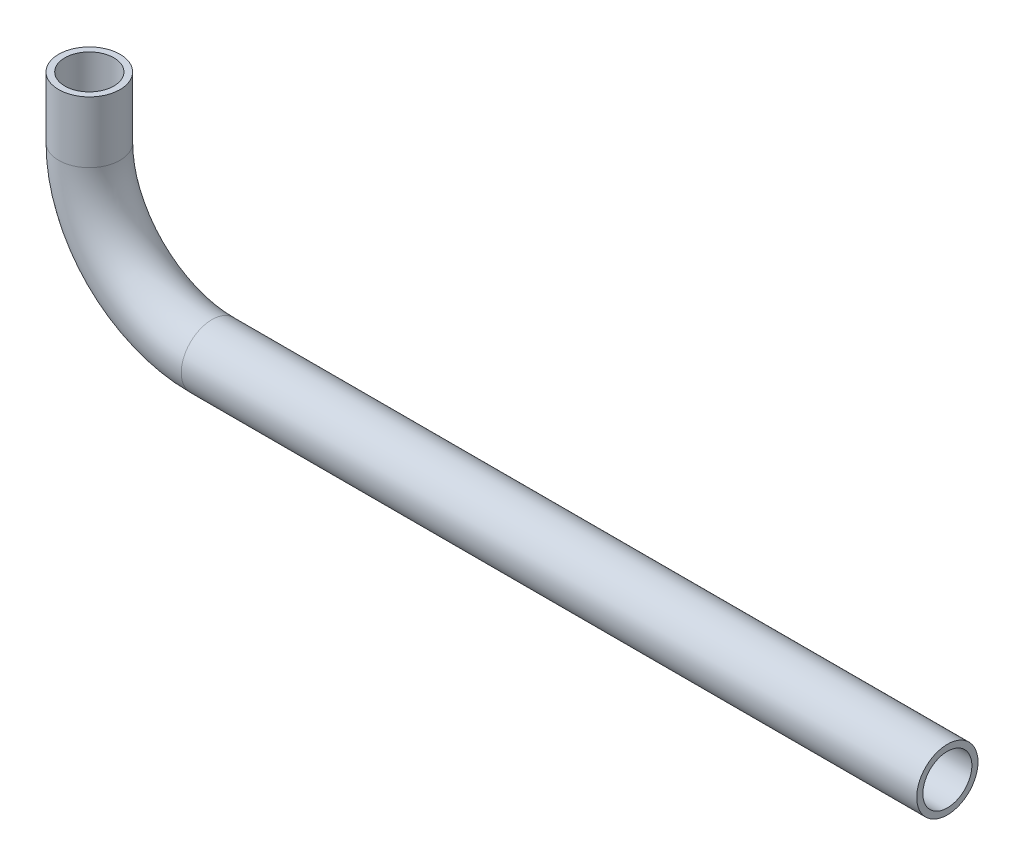
ISO-10303-21;
HEADER;
FILE_DESCRIPTION(('STEP AP214'),'2;1');
FILE_NAME('part.step','',(''),(''),'','','');
FILE_SCHEMA(('AUTOMOTIVE_DESIGN { 1 0 10303 214 1 1 1 1 }'));
ENDSEC;
DATA;
#1=APPLICATION_CONTEXT('core data for automotive mechanical design processes');
#2=APPLICATION_PROTOCOL_DEFINITION('international standard','automotive_design',2000,#1);
#3=PRODUCT_CONTEXT('',#1,'mechanical');
#4=PRODUCT('Part','Part','',(#3));
#5=PRODUCT_RELATED_PRODUCT_CATEGORY('part','',(#4));
#6=PRODUCT_DEFINITION_FORMATION('','',#4);
#7=PRODUCT_DEFINITION_CONTEXT('part definition',#1,'design');
#8=PRODUCT_DEFINITION('design','',#6,#7);
#9=PRODUCT_DEFINITION_SHAPE('','',#8);
#10=(LENGTH_UNIT() NAMED_UNIT(*) SI_UNIT(.MILLI.,.METRE.));
#11=(NAMED_UNIT(*) PLANE_ANGLE_UNIT() SI_UNIT($,.RADIAN.));
#12=(NAMED_UNIT(*) SI_UNIT($,.STERADIAN.) SOLID_ANGLE_UNIT());
#13=UNCERTAINTY_MEASURE_WITH_UNIT(LENGTH_MEASURE(1.E-05),#10,'distance_accuracy_value','');
#14=(GEOMETRIC_REPRESENTATION_CONTEXT(3) GLOBAL_UNCERTAINTY_ASSIGNED_CONTEXT((#13)) GLOBAL_UNIT_ASSIGNED_CONTEXT((#10,
#11,#12)) REPRESENTATION_CONTEXT('',''));
#15=CARTESIAN_POINT('',(0.,0.,0.));
#16=DIRECTION('',(0.,0.,1.));
#17=DIRECTION('',(1.,0.,0.));
#18=AXIS2_PLACEMENT_3D('',#15,#16,#17);
#19=CARTESIAN_POINT('',(-20.,30.,0.));
#20=DIRECTION('',(0.,-1.,0.));
#21=DIRECTION('',(0.,0.,-1.));
#22=AXIS2_PLACEMENT_3D('',#19,#20,#21);
#23=PLANE('',#22);
#24=CARTESIAN_POINT('',(-20.,30.,0.));
#25=DIRECTION('',(0.,-1.,0.));
#26=DIRECTION('',(0.,0.,-1.));
#27=AXIS2_PLACEMENT_3D('',#24,#25,#26);
#28=CIRCLE('',#27,4.);
#29=CARTESIAN_POINT('',(-20.,30.,-4.));
#30=VERTEX_POINT('',#29);
#31=EDGE_CURVE('E72',#30,#30,#28,.T.);
#32=ORIENTED_EDGE('',*,*,#31,.T.);
#33=EDGE_LOOP('',(#32));
#34=FACE_BOUND('',#33,.T.);
#35=CARTESIAN_POINT('',(-20.,30.,0.));
#36=DIRECTION('',(0.,-1.,0.));
#37=DIRECTION('',(0.,0.,-1.));
#38=AXIS2_PLACEMENT_3D('',#35,#36,#37);
#39=CIRCLE('',#38,5.);
#40=CARTESIAN_POINT('',(-20.,30.,-5.));
#41=VERTEX_POINT('',#40);
#42=EDGE_CURVE('E63',#41,#41,#39,.T.);
#43=ORIENTED_EDGE('',*,*,#42,.F.);
#44=EDGE_LOOP('',(#43));
#45=FACE_BOUND('',#44,.T.);
#46=ADVANCED_FACE('F49',(#34,#45),#23,.F.);
#47=CARTESIAN_POINT('',(120.,0.,0.));
#48=DIRECTION('',(1.,0.,0.));
#49=DIRECTION('',(0.,0.,-1.));
#50=AXIS2_PLACEMENT_3D('',#47,#48,#49);
#51=PLANE('',#50);
#52=CARTESIAN_POINT('',(120.,0.,0.));
#53=DIRECTION('',(1.,0.,0.));
#54=DIRECTION('',(0.,0.,-1.));
#55=AXIS2_PLACEMENT_3D('',#52,#53,#54);
#56=CIRCLE('',#55,4.);
#57=CARTESIAN_POINT('',(120.,0.,-4.));
#58=VERTEX_POINT('',#57);
#59=EDGE_CURVE('E68',#58,#58,#56,.T.);
#60=ORIENTED_EDGE('',*,*,#59,.F.);
#61=EDGE_LOOP('',(#60));
#62=FACE_BOUND('',#61,.T.);
#63=CARTESIAN_POINT('',(120.,0.,0.));
#64=DIRECTION('',(1.,0.,0.));
#65=DIRECTION('',(0.,0.,-1.));
#66=AXIS2_PLACEMENT_3D('',#63,#64,#65);
#67=CIRCLE('',#66,5.);
#68=CARTESIAN_POINT('',(120.,0.,-5.));
#69=VERTEX_POINT('',#68);
#70=EDGE_CURVE('E11',#69,#69,#67,.T.);
#71=ORIENTED_EDGE('',*,*,#70,.T.);
#72=EDGE_LOOP('',(#71));
#73=FACE_BOUND('',#72,.T.);
#74=ADVANCED_FACE('F108',(#62,#73),#51,.T.);
#75=CARTESIAN_POINT('',(-20.,30.,0.));
#76=DIRECTION('',(0.,-1.,0.));
#77=DIRECTION('',(0.,0.,-1.));
#78=AXIS2_PLACEMENT_3D('',#75,#76,#77);
#79=CYLINDRICAL_SURFACE('',#78,5.);
#80=CARTESIAN_POINT('',(-20.,20.,0.));
#81=DIRECTION('',(0.,-1.,0.));
#82=DIRECTION('',(0.,0.,-1.));
#83=AXIS2_PLACEMENT_3D('',#80,#81,#82);
#84=CIRCLE('',#83,5.);
#85=CARTESIAN_POINT('',(-25.,20.,0.));
#86=VERTEX_POINT('',#85);
#87=EDGE_CURVE('E59',#86,#86,#84,.T.);
#88=ORIENTED_EDGE('',*,*,#87,.F.);
#89=EDGE_LOOP('',(#88));
#90=FACE_BOUND('',#89,.T.);
#91=ORIENTED_EDGE('',*,*,#42,.T.);
#92=EDGE_LOOP('',(#91));
#93=FACE_BOUND('',#92,.T.);
#94=ADVANCED_FACE('F104',(#90,#93),#79,.T.);
#95=CARTESIAN_POINT('',(0.,20.,0.));
#96=DIRECTION('',(0.,0.,1.));
#97=DIRECTION('',(1.,0.,0.));
#98=AXIS2_PLACEMENT_3D('',#95,#96,#97);
#99=TOROIDAL_SURFACE('',#98,20.,5.);
#100=CARTESIAN_POINT('',(0.,0.,0.));
#101=DIRECTION('',(1.,0.,0.));
#102=DIRECTION('',(0.,0.,-1.));
#103=AXIS2_PLACEMENT_3D('',#100,#101,#102);
#104=CIRCLE('',#103,5.);
#105=CARTESIAN_POINT('',(0.,-5.,0.));
#106=VERTEX_POINT('',#105);
#107=EDGE_CURVE('E55',#106,#106,#104,.T.);
#108=CARTESIAN_POINT('',(0.,20.,0.));
#109=DIRECTION('',(0.,0.,1.));
#110=DIRECTION('',(1.,0.,0.));
#111=AXIS2_PLACEMENT_3D('',#108,#109,#110);
#112=CIRCLE('',#111,25.);
#113=EDGE_CURVE('',#86,#106,#112,.T.);
#114=ORIENTED_EDGE('',*,*,#87,.T.);
#115=ORIENTED_EDGE('',*,*,#107,.F.);
#116=ORIENTED_EDGE('',*,*,#113,.T.);
#117=ORIENTED_EDGE('',*,*,#113,.F.);
#118=EDGE_LOOP('',(#114,#116,#115,#117));
#119=FACE_BOUND('',#118,.T.);
#120=ADVANCED_FACE('F98',(#119),#99,.T.);
#121=CARTESIAN_POINT('',(0.,0.,0.));
#122=DIRECTION('',(1.,0.,0.));
#123=DIRECTION('',(0.,0.,-1.));
#124=AXIS2_PLACEMENT_3D('',#121,#122,#123);
#125=CYLINDRICAL_SURFACE('',#124,5.);
#126=ORIENTED_EDGE('',*,*,#70,.F.);
#127=EDGE_LOOP('',(#126));
#128=FACE_BOUND('',#127,.T.);
#129=ORIENTED_EDGE('',*,*,#107,.T.);
#130=EDGE_LOOP('',(#129));
#131=FACE_BOUND('',#130,.T.);
#132=ADVANCED_FACE('F95',(#128,#131),#125,.T.);
#133=CARTESIAN_POINT('',(-20.,30.,0.));
#134=DIRECTION('',(0.,-1.,0.));
#135=DIRECTION('',(0.,0.,-1.));
#136=AXIS2_PLACEMENT_3D('',#133,#134,#135);
#137=CYLINDRICAL_SURFACE('',#136,4.);
#138=CARTESIAN_POINT('',(-20.,20.,0.));
#139=DIRECTION('',(0.,1.,0.));
#140=DIRECTION('',(-1.,0.,0.));
#141=AXIS2_PLACEMENT_3D('',#138,#139,#140);
#142=CIRCLE('',#141,4.);
#143=CARTESIAN_POINT('',(-24.,20.,0.));
#144=VERTEX_POINT('',#143);
#145=EDGE_CURVE('E75',#144,#144,#142,.F.);
#146=ORIENTED_EDGE('',*,*,#145,.T.);
#147=EDGE_LOOP('',(#146));
#148=FACE_BOUND('',#147,.T.);
#149=ORIENTED_EDGE('',*,*,#31,.F.);
#150=EDGE_LOOP('',(#149));
#151=FACE_BOUND('',#150,.T.);
#152=ADVANCED_FACE('F81',(#148,#151),#137,.F.);
#153=CARTESIAN_POINT('',(0.,20.,0.));
#154=DIRECTION('',(0.,0.,1.));
#155=DIRECTION('',(1.,0.,0.));
#156=AXIS2_PLACEMENT_3D('',#153,#154,#155);
#157=TOROIDAL_SURFACE('',#156,20.,4.);
#158=CARTESIAN_POINT('',(0.,0.,0.));
#159=DIRECTION('',(1.,0.,0.));
#160=DIRECTION('',(0.,0.,-1.));
#161=AXIS2_PLACEMENT_3D('',#158,#159,#160);
#162=CIRCLE('',#161,4.);
#163=CARTESIAN_POINT('',(0.,-4.,0.));
#164=VERTEX_POINT('',#163);
#165=EDGE_CURVE('E71',#164,#164,#162,.T.);
#166=CARTESIAN_POINT('',(0.,20.,0.));
#167=DIRECTION('',(0.,0.,1.));
#168=DIRECTION('',(1.,0.,0.));
#169=AXIS2_PLACEMENT_3D('',#166,#167,#168);
#170=CIRCLE('',#169,24.);
#171=EDGE_CURVE('',#144,#164,#170,.T.);
#172=ORIENTED_EDGE('',*,*,#145,.F.);
#173=ORIENTED_EDGE('',*,*,#165,.T.);
#174=ORIENTED_EDGE('',*,*,#171,.T.);
#175=ORIENTED_EDGE('',*,*,#171,.F.);
#176=EDGE_LOOP('',(#172,#174,#173,#175));
#177=FACE_BOUND('',#176,.T.);
#178=ADVANCED_FACE('F84',(#177),#157,.F.);
#179=CARTESIAN_POINT('',(0.,0.,0.));
#180=DIRECTION('',(1.,0.,0.));
#181=DIRECTION('',(0.,0.,-1.));
#182=AXIS2_PLACEMENT_3D('',#179,#180,#181);
#183=CYLINDRICAL_SURFACE('',#182,4.);
#184=ORIENTED_EDGE('',*,*,#59,.T.);
#185=EDGE_LOOP('',(#184));
#186=FACE_BOUND('',#185,.T.);
#187=ORIENTED_EDGE('',*,*,#165,.F.);
#188=EDGE_LOOP('',(#187));
#189=FACE_BOUND('',#188,.T.);
#190=ADVANCED_FACE('F86',(#186,#189),#183,.F.);
#191=CLOSED_SHELL('',(#46,#74,#94,#120,#132,#152,#178,#190));
#192=MANIFOLD_SOLID_BREP('B2',#191);
#193=ADVANCED_BREP_SHAPE_REPRESENTATION('',(#18,#192),#14);
#194=SHAPE_DEFINITION_REPRESENTATION(#9,#193);
ENDSEC;
END-ISO-10303-21;
